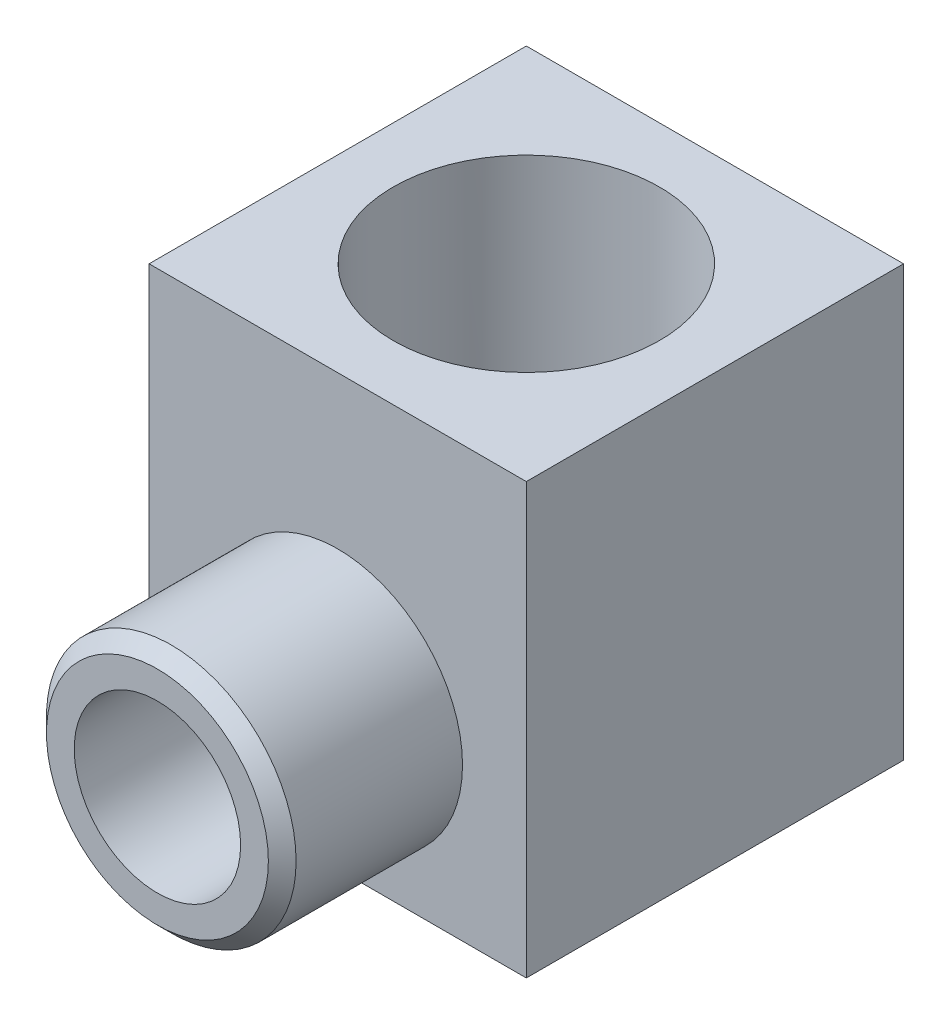
ISO-10303-21;
HEADER;
FILE_DESCRIPTION(('STEP AP214'),'2;1');
FILE_NAME('part.step','',(''),(''),'','','');
FILE_SCHEMA(('AUTOMOTIVE_DESIGN { 1 0 10303 214 1 1 1 1 }'));
ENDSEC;
DATA;
#1=APPLICATION_CONTEXT('core data for automotive mechanical design processes');
#2=APPLICATION_PROTOCOL_DEFINITION('international standard','automotive_design',2000,#1);
#3=PRODUCT_CONTEXT('',#1,'mechanical');
#4=PRODUCT('Part','Part','',(#3));
#5=PRODUCT_RELATED_PRODUCT_CATEGORY('part','',(#4));
#6=PRODUCT_DEFINITION_FORMATION('','',#4);
#7=PRODUCT_DEFINITION_CONTEXT('part definition',#1,'design');
#8=PRODUCT_DEFINITION('design','',#6,#7);
#9=PRODUCT_DEFINITION_SHAPE('','',#8);
#10=(LENGTH_UNIT() NAMED_UNIT(*) SI_UNIT(.MILLI.,.METRE.));
#11=(NAMED_UNIT(*) PLANE_ANGLE_UNIT() SI_UNIT($,.RADIAN.));
#12=(NAMED_UNIT(*) SI_UNIT($,.STERADIAN.) SOLID_ANGLE_UNIT());
#13=UNCERTAINTY_MEASURE_WITH_UNIT(LENGTH_MEASURE(1.E-05),#10,'distance_accuracy_value','');
#14=(GEOMETRIC_REPRESENTATION_CONTEXT(3) GLOBAL_UNCERTAINTY_ASSIGNED_CONTEXT((#13)) GLOBAL_UNIT_ASSIGNED_CONTEXT((#10,
#11,#12)) REPRESENTATION_CONTEXT('',''));
#15=CARTESIAN_POINT('',(0.,0.,0.));
#16=DIRECTION('',(0.,0.,1.));
#17=DIRECTION('',(1.,0.,0.));
#18=AXIS2_PLACEMENT_3D('',#15,#16,#17);
#19=CARTESIAN_POINT('',(0.,0.,13.6));
#20=DIRECTION('',(0.,0.,1.));
#21=DIRECTION('',(1.,0.,0.));
#22=AXIS2_PLACEMENT_3D('',#19,#20,#21);
#23=PLANE('',#22);
#24=CARTESIAN_POINT('',(0.,0.,13.6));
#25=DIRECTION('',(0.,0.,1.));
#26=DIRECTION('',(1.,0.,0.));
#27=AXIS2_PLACEMENT_3D('',#24,#25,#26);
#28=CIRCLE('',#27,4.5);
#29=CARTESIAN_POINT('',(4.5,0.,13.6));
#30=VERTEX_POINT('',#29);
#31=EDGE_CURVE('E119',#30,#30,#28,.T.);
#32=ORIENTED_EDGE('',*,*,#31,.F.);
#33=EDGE_LOOP('',(#32));
#34=FACE_BOUND('',#33,.T.);
#35=DIRECTION('',(0.,-1.,0.));
#36=VECTOR('',#35,1.);
#37=CARTESIAN_POINT('',(-6.8,-5.5,13.6));
#38=LINE('',#37,#36);
#39=CARTESIAN_POINT('',(-6.8,10.,13.6));
#40=VERTEX_POINT('',#39);
#41=CARTESIAN_POINT('',(-6.8,-5.5,13.6));
#42=VERTEX_POINT('',#41);
#43=EDGE_CURVE('E104',#40,#42,#38,.T.);
#44=ORIENTED_EDGE('',*,*,#43,.T.);
#45=DIRECTION('',(1.,0.,0.));
#46=VECTOR('',#45,1.);
#47=CARTESIAN_POINT('',(-6.8,-5.5,13.6));
#48=LINE('',#47,#46);
#49=CARTESIAN_POINT('',(6.8,-5.5,13.6));
#50=VERTEX_POINT('',#49);
#51=EDGE_CURVE('E67',#42,#50,#48,.T.);
#52=ORIENTED_EDGE('',*,*,#51,.T.);
#53=DIRECTION('',(0.,1.,0.));
#54=VECTOR('',#53,1.);
#55=CARTESIAN_POINT('',(6.8,-5.5,13.6));
#56=LINE('',#55,#54);
#57=CARTESIAN_POINT('',(6.8,10.,13.6));
#58=VERTEX_POINT('',#57);
#59=EDGE_CURVE('E95',#50,#58,#56,.T.);
#60=ORIENTED_EDGE('',*,*,#59,.T.);
#61=DIRECTION('',(-1.,0.,0.));
#62=VECTOR('',#61,1.);
#63=CARTESIAN_POINT('',(-6.8,10.,13.6));
#64=LINE('',#63,#62);
#65=EDGE_CURVE('E101',#58,#40,#64,.T.);
#66=ORIENTED_EDGE('',*,*,#65,.T.);
#67=EDGE_LOOP('',(#44,#52,#60,#66));
#68=FACE_BOUND('',#67,.T.);
#69=ADVANCED_FACE('F43',(#34,#68),#23,.T.);
#70=CARTESIAN_POINT('',(0.,0.,13.6));
#71=DIRECTION('',(0.,0.,1.));
#72=DIRECTION('',(1.,0.,0.));
#73=AXIS2_PLACEMENT_3D('',#70,#71,#72);
#74=CYLINDRICAL_SURFACE('',#73,4.5);
#75=CARTESIAN_POINT('',(0.,0.,19.6));
#76=DIRECTION('',(0.,0.,1.));
#77=DIRECTION('',(1.,0.,0.));
#78=AXIS2_PLACEMENT_3D('',#75,#76,#77);
#79=CIRCLE('',#78,4.5);
#80=CARTESIAN_POINT('',(4.5,0.,19.6));
#81=VERTEX_POINT('',#80);
#82=EDGE_CURVE('E13',#81,#81,#79,.F.);
#83=CARTESIAN_POINT('',(4.5,0.,19.6));
#84=CARTESIAN_POINT('',(4.5,0.,19.5375));
#85=CARTESIAN_POINT('',(4.5,0.,19.475));
#86=CARTESIAN_POINT('',(4.5,0.,19.35));
#87=CARTESIAN_POINT('',(4.5,0.,19.2875));
#88=CARTESIAN_POINT('',(4.5,0.,19.1625));
#89=CARTESIAN_POINT('',(4.5,0.,19.1));
#90=CARTESIAN_POINT('',(4.5,0.,18.975));
#91=CARTESIAN_POINT('',(4.5,0.,18.9125));
#92=CARTESIAN_POINT('',(4.5,0.,18.7875));
#93=CARTESIAN_POINT('',(4.5,0.,18.725));
#94=CARTESIAN_POINT('',(4.5,0.,18.6));
#95=CARTESIAN_POINT('',(4.5,0.,18.5375));
#96=CARTESIAN_POINT('',(4.5,0.,18.4125));
#97=CARTESIAN_POINT('',(4.5,0.,18.35));
#98=CARTESIAN_POINT('',(4.5,0.,18.225));
#99=CARTESIAN_POINT('',(4.5,0.,18.1625));
#100=CARTESIAN_POINT('',(4.5,0.,18.0375));
#101=CARTESIAN_POINT('',(4.5,0.,17.975));
#102=CARTESIAN_POINT('',(4.5,0.,17.85));
#103=CARTESIAN_POINT('',(4.5,0.,17.7875));
#104=CARTESIAN_POINT('',(4.5,0.,17.6625));
#105=CARTESIAN_POINT('',(4.5,0.,17.6));
#106=CARTESIAN_POINT('',(4.5,0.,17.475));
#107=CARTESIAN_POINT('',(4.5,0.,17.4125));
#108=CARTESIAN_POINT('',(4.5,0.,17.2875));
#109=CARTESIAN_POINT('',(4.5,0.,17.225));
#110=CARTESIAN_POINT('',(4.5,0.,17.1));
#111=CARTESIAN_POINT('',(4.5,0.,17.0375));
#112=CARTESIAN_POINT('',(4.5,0.,16.9125));
#113=CARTESIAN_POINT('',(4.5,0.,16.85));
#114=CARTESIAN_POINT('',(4.5,0.,16.725));
#115=CARTESIAN_POINT('',(4.5,0.,16.6625));
#116=CARTESIAN_POINT('',(4.5,0.,16.5375));
#117=CARTESIAN_POINT('',(4.5,0.,16.475));
#118=CARTESIAN_POINT('',(4.5,0.,16.35));
#119=CARTESIAN_POINT('',(4.5,0.,16.2875));
#120=CARTESIAN_POINT('',(4.5,0.,16.1625));
#121=CARTESIAN_POINT('',(4.5,0.,16.1));
#122=CARTESIAN_POINT('',(4.5,0.,15.975));
#123=CARTESIAN_POINT('',(4.5,0.,15.9125));
#124=CARTESIAN_POINT('',(4.5,0.,15.7875));
#125=CARTESIAN_POINT('',(4.5,0.,15.725));
#126=CARTESIAN_POINT('',(4.5,0.,15.6));
#127=CARTESIAN_POINT('',(4.5,0.,15.5375));
#128=CARTESIAN_POINT('',(4.5,0.,15.4125));
#129=CARTESIAN_POINT('',(4.5,0.,15.35));
#130=CARTESIAN_POINT('',(4.5,0.,15.225));
#131=CARTESIAN_POINT('',(4.5,0.,15.1625));
#132=CARTESIAN_POINT('',(4.5,0.,15.0375));
#133=CARTESIAN_POINT('',(4.5,0.,14.975));
#134=CARTESIAN_POINT('',(4.5,0.,14.85));
#135=CARTESIAN_POINT('',(4.5,0.,14.7875));
#136=CARTESIAN_POINT('',(4.5,0.,14.6625));
#137=CARTESIAN_POINT('',(4.5,0.,14.6));
#138=CARTESIAN_POINT('',(4.5,0.,14.475));
#139=CARTESIAN_POINT('',(4.5,0.,14.4125));
#140=CARTESIAN_POINT('',(4.5,0.,14.2875));
#141=CARTESIAN_POINT('',(4.5,0.,14.225));
#142=CARTESIAN_POINT('',(4.5,0.,14.1));
#143=CARTESIAN_POINT('',(4.5,0.,14.0375));
#144=CARTESIAN_POINT('',(4.5,0.,13.9125));
#145=CARTESIAN_POINT('',(4.5,0.,13.85));
#146=CARTESIAN_POINT('',(4.5,0.,13.725));
#147=CARTESIAN_POINT('',(4.5,0.,13.6625));
#148=CARTESIAN_POINT('',(4.5,0.,13.6));
#149=B_SPLINE_CURVE_WITH_KNOTS('',3,(#83,#84,#85,#86,#87,#88,#89,#90,#91,#92,#93,#94,#95,#96,
#97,#98,#99,#100,#101,#102,#103,#104,#105,#106,#107,#108,#109,#110,#111,#112,#113,#114,#115,
#116,#117,#118,#119,#120,#121,#122,#123,#124,#125,#126,#127,#128,#129,#130,#131,#132,#133,#134,
#135,#136,#137,#138,#139,#140,#141,#142,#143,#144,#145,#146,#147,#148),.UNSPECIFIED.,.F.,.F.,(4,
2,2,2,2,2,2,2,2,2,2,2,2,2,2,2,2,2,2,2,2,2,2,2,2,2,2,2,2,2,2,2,4),(0.,0.1875,0.375000000000004,
0.562500000000004,0.750000000000004,0.937500000000004,1.125,1.3125,1.5,1.6875,1.87500000000001,
2.06250000000001,2.25000000000001,2.43750000000001,2.62500000000001,2.81250000000001,
3.00000000000001,3.18750000000001,3.37500000000001,3.56250000000001,3.75000000000001,
3.93750000000001,4.12500000000001,4.31250000000001,4.50000000000001,4.68750000000001,
4.87500000000001,5.06250000000001,5.25000000000001,5.43750000000001,5.62500000000001,
5.81250000000001,6.00000000000001),.UNSPECIFIED.);
#150=EDGE_CURVE('BSEAM136',#81,#30,#149,.T.);
#151=ORIENTED_EDGE('',*,*,#82,.T.);
#152=ORIENTED_EDGE('',*,*,#31,.T.);
#153=ORIENTED_EDGE('',*,*,#150,.T.);
#154=ORIENTED_EDGE('',*,*,#150,.F.);
#155=EDGE_LOOP('',(#151,#153,#152,#154));
#156=FACE_BOUND('',#155,.T.);
#157=ADVANCED_FACE('F136',(#156),#74,.T.);
#158=CARTESIAN_POINT('',(0.,0.,20.1));
#159=DIRECTION('',(0.,0.,1.));
#160=DIRECTION('',(1.,0.,0.));
#161=AXIS2_PLACEMENT_3D('',#158,#159,#160);
#162=PLANE('',#161);
#163=CARTESIAN_POINT('',(0.,0.,20.1));
#164=DIRECTION('',(0.,0.,1.));
#165=DIRECTION('',(1.,0.,0.));
#166=AXIS2_PLACEMENT_3D('',#163,#164,#165);
#167=CIRCLE('',#166,3.);
#168=CARTESIAN_POINT('',(3.,0.,20.1));
#169=VERTEX_POINT('',#168);
#170=EDGE_CURVE('E116',#169,#169,#167,.T.);
#171=ORIENTED_EDGE('',*,*,#170,.F.);
#172=EDGE_LOOP('',(#171));
#173=FACE_BOUND('',#172,.T.);
#174=CARTESIAN_POINT('',(0.,0.,20.1));
#175=DIRECTION('',(0.,0.,1.));
#176=DIRECTION('',(1.,0.,0.));
#177=AXIS2_PLACEMENT_3D('',#174,#175,#176);
#178=CIRCLE('',#177,4.00000000000002);
#179=CARTESIAN_POINT('',(4.00000000000002,0.,20.1));
#180=VERTEX_POINT('',#179);
#181=EDGE_CURVE('E52',#180,#180,#178,.T.);
#182=ORIENTED_EDGE('',*,*,#181,.T.);
#183=EDGE_LOOP('',(#182));
#184=FACE_BOUND('',#183,.T.);
#185=ADVANCED_FACE('F125',(#173,#184),#162,.T.);
#186=CARTESIAN_POINT('',(0.,0.,20.1));
#187=DIRECTION('',(0.,0.,-1.));
#188=DIRECTION('',(-1.,0.,0.));
#189=AXIS2_PLACEMENT_3D('',#186,#187,#188);
#190=CONICAL_SURFACE('',#189,4.00000000000002,0.785398163397441);
#191=ORIENTED_EDGE('',*,*,#82,.F.);
#192=EDGE_LOOP('',(#191));
#193=FACE_BOUND('',#192,.T.);
#194=ORIENTED_EDGE('',*,*,#181,.F.);
#195=EDGE_LOOP('',(#194));
#196=FACE_BOUND('',#195,.T.);
#197=ADVANCED_FACE('F46',(#193,#196),#190,.T.);
#198=CARTESIAN_POINT('',(0.,0.,10.1));
#199=DIRECTION('',(0.,0.,1.));
#200=DIRECTION('',(1.,0.,0.));
#201=AXIS2_PLACEMENT_3D('',#198,#199,#200);
#202=CYLINDRICAL_SURFACE('',#201,3.);
#203=CARTESIAN_POINT('',(3.,0.,10.546998799039));
#204=CARTESIAN_POINT('',(2.99999929316566,-0.0745881017346189,10.546999898665));
#205=CARTESIAN_POINT('',(2.99721098330608,-0.149191136004952,10.549237888807));
#206=CARTESIAN_POINT('',(2.98612019809028,-0.297740615457289,10.5580750774283));
#207=CARTESIAN_POINT('',(2.9778144749812,-0.371686647908522,10.5646768445764));
#208=CARTESIAN_POINT('',(2.94477114070038,-0.591871257292455,10.5906674427021));
#209=CARTESIAN_POINT('',(2.91190789135751,-0.736257997426775,10.6162404352537));
#210=CARTESIAN_POINT('',(2.82691460569437,-1.01471783745388,10.6795972491244));
#211=CARTESIAN_POINT('',(2.77495153631042,-1.14886849806612,10.7172749045985));
#212=CARTESIAN_POINT('',(2.65372699717079,-1.40641023040088,10.8003920106133));
#213=CARTESIAN_POINT('',(2.58446505555621,-1.52980100850371,10.8458316728664));
#214=CARTESIAN_POINT('',(2.41977218910693,-1.7804807775644,10.9467107014625));
#215=CARTESIAN_POINT('',(2.32207710800338,-1.90607199000542,11.0026737741389));
#216=CARTESIAN_POINT('',(2.10795031988918,-2.14051386194855,11.1140660424004));
#217=CARTESIAN_POINT('',(1.99150246679738,-2.24934993594435,11.1694947339013));
#218=CARTESIAN_POINT('',(1.72600788699425,-2.46026435780722,11.2815142972558));
#219=CARTESIAN_POINT('',(1.57472321111582,-2.55994342134052,11.3374386533781));
#220=CARTESIAN_POINT('',(1.33396074652115,-2.68865418568348,11.4116870220653));
#221=CARTESIAN_POINT('',(1.25137489168925,-2.72809816599973,11.4348353971046));
#222=CARTESIAN_POINT('',(1.08211052113866,-2.79954562243594,11.4772452437052));
#223=CARTESIAN_POINT('',(0.995434882072555,-2.8315542372461,11.4965093984854));
#224=CARTESIAN_POINT('',(0.827640357499887,-2.88478057830754,11.5288011093659));
#225=CARTESIAN_POINT('',(0.746846377534298,-2.90676237182174,11.5422624318136));
#226=CARTESIAN_POINT('',(0.583197091078556,-2.94396274357603,11.56515490291));
#227=CARTESIAN_POINT('',(0.500343004130003,-2.95918522705945,11.5745883785567));
#228=CARTESIAN_POINT('',(0.333318539828547,-2.98261655716146,11.5891456440168));
#229=CARTESIAN_POINT('',(0.24914900909258,-2.99082973981614,11.5942720981739));
#230=CARTESIAN_POINT('',(0.0802937359917337,-3.00011905606704,11.6000735008694));
#231=CARTESIAN_POINT('',(-0.00439194583256893,-3.00119601115591,11.6007489617875));
#232=CARTESIAN_POINT('',(-0.23525409786637,-2.99432955174349,11.5964537554331));
#233=CARTESIAN_POINT('',(-0.381218214584867,-2.97923219630627,11.5870044907645));
#234=CARTESIAN_POINT('',(-0.667963793545683,-2.92832373843973,11.5554908393159));
#235=CARTESIAN_POINT('',(-0.808744863218141,-2.89251107042813,11.5334254990639));
#236=CARTESIAN_POINT('',(-1.0821263901114,-2.80174972886362,11.4785140485211));
#237=CARTESIAN_POINT('',(-1.21470488589566,-2.74675209652792,11.4456403685046));
#238=CARTESIAN_POINT('',(-1.4688481448743,-2.61967531320565,11.3716555010842));
#239=CARTESIAN_POINT('',(-1.59041039016418,-2.54759227067433,11.3305424373257));
#240=CARTESIAN_POINT('',(-1.835311796849,-2.37833229975016,11.2374372946823));
#241=CARTESIAN_POINT('',(-1.95698945502121,-2.27914886819721,11.1847280754551));
#242=CARTESIAN_POINT('',(-2.1830368025769,-2.06368231559825,11.0766911317327));
#243=CARTESIAN_POINT('',(-2.2873808620927,-1.94737434443897,11.021359682503));
#244=CARTESIAN_POINT('',(-2.48965064603807,-1.68310649607655,10.9057146019591));
#245=CARTESIAN_POINT('',(-2.58495875584479,-1.53299668379983,10.8456939524099));
#246=CARTESIAN_POINT('',(-2.74862769089555,-1.21524931540846,10.7363393381382));
#247=CARTESIAN_POINT('',(-2.81703815455924,-1.04764477562142,10.6869857643463));
#248=CARTESIAN_POINT('',(-2.9092456014676,-0.744553432256006,10.6182050378));
#249=CARTESIAN_POINT('',(-2.94004419848779,-0.612213688389327,10.5943209038978));
#250=CARTESIAN_POINT('',(-2.98344404773024,-0.342923548280771,10.5602993324478));
#251=CARTESIAN_POINT('',(-2.9960701607893,-0.205979713803309,10.5501431156064));
#252=CARTESIAN_POINT('',(-3.00236485457848,0.0689488376058324,10.5451072068206));
#253=CARTESIAN_POINT('',(-2.99598999132347,0.20693521924979,10.5502625231937));
#254=CARTESIAN_POINT('',(-2.9646176358833,0.479473378491058,10.5751050208752));
#255=CARTESIAN_POINT('',(-2.93960472155185,0.614022216261175,10.5948042364801));
#256=CARTESIAN_POINT('',(-2.87291834540731,0.874124179944719,10.6455214831968));
#257=CARTESIAN_POINT('',(-2.83152632032177,0.999789033265991,10.6763475769699));
#258=CARTESIAN_POINT('',(-2.73365926139293,1.24268938558944,10.7459736560647));
#259=CARTESIAN_POINT('',(-2.67717887421443,1.35992187402312,10.7847764703902));
#260=CARTESIAN_POINT('',(-2.53836720017101,1.60633545923451,10.8748933687563));
#261=CARTESIAN_POINT('',(-2.45316148843195,1.7335420193793,10.9271829389867));
#262=CARTESIAN_POINT('',(-2.26486412265136,1.97324020138555,11.0334530687461));
#263=CARTESIAN_POINT('',(-2.1617539118516,2.08571634191255,11.0874353345946));
#264=CARTESIAN_POINT('',(-1.92088094045174,2.31117689222138,11.2012043172883));
#265=CARTESIAN_POINT('',(-1.78021293053271,2.42135314053419,11.260534535643));
#266=CARTESIAN_POINT('',(-1.55436650534371,2.56749122991443,11.3420699926765));
#267=CARTESIAN_POINT('',(-1.47656966285657,2.61303335570715,11.3680157539303));
#268=CARTESIAN_POINT('',(-1.31641811917015,2.69726035235891,11.4167117473753));
#269=CARTESIAN_POINT('',(-1.23406631148695,2.73594951234181,11.4394639764651));
#270=CARTESIAN_POINT('',(-1.07033545025543,2.80388454782464,11.4798578036107));
#271=CARTESIAN_POINT('',(-0.989186787161121,2.83355352146009,11.4977220373192));
#272=CARTESIAN_POINT('',(-0.823964002411379,2.88592934138068,11.5294983493486));
#273=CARTESIAN_POINT('',(-0.73989160566671,2.90864021766085,11.5434127150122));
#274=CARTESIAN_POINT('',(-0.569568403790919,2.94672608268705,11.56686144186));
#275=CARTESIAN_POINT('',(-0.483319568335496,2.96210747043806,11.5763996233974));
#276=CARTESIAN_POINT('',(-0.309457807201864,2.98528725569192,11.5908102115971));
#277=CARTESIAN_POINT('',(-0.221845109617277,2.9930869076186,11.5956833900979));
#278=CARTESIAN_POINT('',(0.015732128986733,3.00368567812967,11.6022981498607));
#279=CARTESIAN_POINT('',(0.166246840469984,2.99911891389451,11.5994324445691));
#280=CARTESIAN_POINT('',(0.463899819096645,2.96769893014043,11.5798637291373));
#281=CARTESIAN_POINT('',(0.611038239138945,2.94084672189619,11.5631613468813));
#282=CARTESIAN_POINT('',(0.892896712692992,2.86761309177773,11.5183049932528));
#283=CARTESIAN_POINT('',(1.02787049942438,2.82194150915025,11.4905684106792));
#284=CARTESIAN_POINT('',(1.28811642039744,2.7130566476404,11.4258796569649));
#285=CARTESIAN_POINT('',(1.41338691327628,2.64984040924037,11.3889259311383));
#286=CARTESIAN_POINT('',(1.66477557190228,2.5004144647402,11.3042080866156));
#287=CARTESIAN_POINT('',(1.78963214589427,2.4124992108767,11.255720022211));
#288=CARTESIAN_POINT('',(2.02372001952908,2.21981612119762,11.1544074079875));
#289=CARTESIAN_POINT('',(2.13293342221275,2.11502926945988,11.1015779983414));
#290=CARTESIAN_POINT('',(2.34893659863772,1.87412098185594,10.9880099385829));
#291=CARTESIAN_POINT('',(2.45310793497384,1.73566006489574,10.927228861111));
#292=CARTESIAN_POINT('',(2.63705578214576,1.44085270830682,10.8121957694996));
#293=CARTESIAN_POINT('',(2.71684578498669,1.28451622662135,10.7579401544537));
#294=CARTESIAN_POINT('',(2.83437875294913,0.992633639054684,10.6743144773585));
#295=CARTESIAN_POINT('',(2.87750950292067,0.860075313414846,10.6420956720645));
#296=CARTESIAN_POINT('',(2.94510742103823,0.588072788398753,10.5905402972548));
#297=CARTESIAN_POINT('',(2.9696336689222,0.448651896240468,10.5711629738052));
#298=CARTESIAN_POINT('',(2.98943816567419,0.256728006424666,10.5554342916873));
#299=CARTESIAN_POINT('',(2.9933932060555,0.205529369149598,10.5522799316812));
#300=CARTESIAN_POINT('',(2.9986746975097,0.102889561257915,10.5480615432784));
#301=CARTESIAN_POINT('',(3.00000048755026,0.0514483329079787,10.5469980405545));
#302=CARTESIAN_POINT('',(3.,0.,10.546998799039));
#303=B_SPLINE_CURVE_WITH_KNOTS('',3,(#203,#204,#205,#206,#207,#208,#209,#210,#211,#212,#213,
#214,#215,#216,#217,#218,#219,#220,#221,#222,#223,#224,#225,#226,#227,#228,#229,#230,#231,#232,
#233,#234,#235,#236,#237,#238,#239,#240,#241,#242,#243,#244,#245,#246,#247,#248,#249,#250,#251,
#252,#253,#254,#255,#256,#257,#258,#259,#260,#261,#262,#263,#264,#265,#266,#267,#268,#269,#270,
#271,#272,#273,#274,#275,#276,#277,#278,#279,#280,#281,#282,#283,#284,#285,#286,#287,#288,#289,
#290,#291,#292,#293,#294,#295,#296,#297,#298,#299,#300,#301,#302),.UNSPECIFIED.,.T.,.F.,(4,2,2,
2,2,2,2,2,2,2,2,2,2,2,2,2,2,2,2,2,2,2,2,2,2,2,2,2,2,2,2,2,2,2,2,2,2,2,2,2,2,2,2,2,2,2,2,2,2,4),
(0.,0.223698379030153,0.447528551993395,0.895774656917625,1.34019202107759,1.78462150887126,
2.28867358422085,2.79316199031455,3.35851235119164,3.64135057040777,3.92399273051411,
4.17804174891848,4.43194379695804,4.68568866411136,4.9394043207104,5.37821651649737,
5.81706188032703,6.25703544231605,6.69710931356922,7.19194896244635,7.68751390285538,
8.24779447657587,8.80703616879964,9.2191874580394,9.63077436668791,10.0433030522907,
10.4561734663549,10.8622379427593,11.2684466822042,11.7519928531561,12.2360432101591,
12.7976792143743,13.0787653432056,13.3596749198207,13.6239750151271,13.888121742296,
14.1520374318989,14.4159094483226,14.8652148947105,15.3144999535135,15.7481981168537,
16.1819694830167,16.6607639167175,17.1401018251204,17.6885320762176,18.2366582881569,
18.6642541125975,19.0904863292288,19.2447470758086,19.3990466009026),.UNSPECIFIED.);
#304=CARTESIAN_POINT('',(3.,0.,10.546998799039));
#305=VERTEX_POINT('',#304);
#306=EDGE_CURVE('E106',#305,#305,#303,.T.);
#307=ORIENTED_EDGE('',*,*,#306,.T.);
#308=EDGE_LOOP('',(#307));
#309=FACE_BOUND('',#308,.T.);
#310=ORIENTED_EDGE('',*,*,#170,.T.);
#311=EDGE_LOOP('',(#310));
#312=FACE_BOUND('',#311,.T.);
#313=ADVANCED_FACE('F128',(#309,#312),#202,.F.);
#314=CARTESIAN_POINT('',(-6.8,-5.5,-36.5659058687187));
#315=DIRECTION('',(0.,-1.,0.));
#316=DIRECTION('',(0.,0.,-1.));
#317=AXIS2_PLACEMENT_3D('',#314,#315,#316);
#318=PLANE('',#317);
#319=DIRECTION('',(0.,0.,1.));
#320=VECTOR('',#319,1.);
#321=CARTESIAN_POINT('',(6.8,-5.5,-36.5659058687187));
#322=LINE('',#321,#320);
#323=CARTESIAN_POINT('',(6.8,-5.5,0.));
#324=VERTEX_POINT('',#323);
#325=EDGE_CURVE('E84',#324,#50,#322,.T.);
#326=ORIENTED_EDGE('',*,*,#325,.T.);
#327=ORIENTED_EDGE('',*,*,#51,.F.);
#328=DIRECTION('',(0.,0.,1.));
#329=VECTOR('',#328,1.);
#330=CARTESIAN_POINT('',(-6.8,-5.5,-36.5659058687187));
#331=LINE('',#330,#329);
#332=CARTESIAN_POINT('',(-6.8,-5.5,0.));
#333=VERTEX_POINT('',#332);
#334=EDGE_CURVE('E92',#333,#42,#331,.T.);
#335=ORIENTED_EDGE('',*,*,#334,.F.);
#336=DIRECTION('',(-1.,0.,0.));
#337=VECTOR('',#336,1.);
#338=CARTESIAN_POINT('',(-6.8,-5.5,0.));
#339=LINE('',#338,#337);
#340=EDGE_CURVE('E88',#324,#333,#339,.T.);
#341=ORIENTED_EDGE('',*,*,#340,.F.);
#342=EDGE_LOOP('',(#326,#327,#335,#341));
#343=FACE_BOUND('',#342,.T.);
#344=ADVANCED_FACE('F86',(#343),#318,.T.);
#345=CARTESIAN_POINT('',(6.8,-5.5,-36.5659058687187));
#346=DIRECTION('',(1.,0.,0.));
#347=DIRECTION('',(0.,0.,-1.));
#348=AXIS2_PLACEMENT_3D('',#345,#346,#347);
#349=PLANE('',#348);
#350=DIRECTION('',(0.,0.,1.));
#351=VECTOR('',#350,1.);
#352=CARTESIAN_POINT('',(6.8,10.,-36.5659058687187));
#353=LINE('',#352,#351);
#354=CARTESIAN_POINT('',(6.8,10.,0.));
#355=VERTEX_POINT('',#354);
#356=EDGE_CURVE('E91',#355,#58,#353,.T.);
#357=ORIENTED_EDGE('',*,*,#356,.T.);
#358=ORIENTED_EDGE('',*,*,#59,.F.);
#359=ORIENTED_EDGE('',*,*,#325,.F.);
#360=DIRECTION('',(0.,-1.,0.));
#361=VECTOR('',#360,1.);
#362=CARTESIAN_POINT('',(6.8,-5.5,0.));
#363=LINE('',#362,#361);
#364=EDGE_CURVE('E120',#355,#324,#363,.T.);
#365=ORIENTED_EDGE('',*,*,#364,.F.);
#366=EDGE_LOOP('',(#357,#358,#359,#365));
#367=FACE_BOUND('',#366,.T.);
#368=ADVANCED_FACE('F96',(#367),#349,.T.);
#369=CARTESIAN_POINT('',(-6.8,10.,-36.5659058687187));
#370=DIRECTION('',(0.,1.,0.));
#371=DIRECTION('',(0.,0.,1.));
#372=AXIS2_PLACEMENT_3D('',#369,#370,#371);
#373=PLANE('',#372);
#374=CARTESIAN_POINT('',(0.,10.,6.8));
#375=DIRECTION('',(0.,1.,0.));
#376=DIRECTION('',(0.,0.,1.));
#377=AXIS2_PLACEMENT_3D('',#374,#375,#376);
#378=CIRCLE('',#377,4.8);
#379=CARTESIAN_POINT('',(0.,10.,11.6));
#380=VERTEX_POINT('',#379);
#381=EDGE_CURVE('E257',#380,#380,#378,.T.);
#382=ORIENTED_EDGE('',*,*,#381,.F.);
#383=EDGE_LOOP('',(#382));
#384=FACE_BOUND('',#383,.T.);
#385=DIRECTION('',(0.,0.,1.));
#386=VECTOR('',#385,1.);
#387=CARTESIAN_POINT('',(-6.8,10.,-36.5659058687187));
#388=LINE('',#387,#386);
#389=CARTESIAN_POINT('',(-6.8,10.,0.));
#390=VERTEX_POINT('',#389);
#391=EDGE_CURVE('E59',#390,#40,#388,.T.);
#392=ORIENTED_EDGE('',*,*,#391,.T.);
#393=ORIENTED_EDGE('',*,*,#65,.F.);
#394=ORIENTED_EDGE('',*,*,#356,.F.);
#395=DIRECTION('',(1.,0.,0.));
#396=VECTOR('',#395,1.);
#397=CARTESIAN_POINT('',(-6.8,10.,0.));
#398=LINE('',#397,#396);
#399=EDGE_CURVE('E165',#390,#355,#398,.T.);
#400=ORIENTED_EDGE('',*,*,#399,.F.);
#401=EDGE_LOOP('',(#392,#393,#394,#400));
#402=FACE_BOUND('',#401,.T.);
#403=ADVANCED_FACE('F161',(#384,#402),#373,.T.);
#404=CARTESIAN_POINT('',(-6.8,-5.5,-36.5659058687187));
#405=DIRECTION('',(-1.,0.,0.));
#406=DIRECTION('',(0.,0.,1.));
#407=AXIS2_PLACEMENT_3D('',#404,#405,#406);
#408=PLANE('',#407);
#409=ORIENTED_EDGE('',*,*,#334,.T.);
#410=ORIENTED_EDGE('',*,*,#43,.F.);
#411=ORIENTED_EDGE('',*,*,#391,.F.);
#412=DIRECTION('',(0.,1.,0.));
#413=VECTOR('',#412,1.);
#414=CARTESIAN_POINT('',(-6.8,-5.5,0.));
#415=LINE('',#414,#413);
#416=EDGE_CURVE('E115',#333,#390,#415,.T.);
#417=ORIENTED_EDGE('',*,*,#416,.F.);
#418=EDGE_LOOP('',(#409,#410,#411,#417));
#419=FACE_BOUND('',#418,.T.);
#420=ADVANCED_FACE('F152',(#419),#408,.T.);
#421=CARTESIAN_POINT('',(0.,0.,0.));
#422=DIRECTION('',(0.,0.,1.));
#423=DIRECTION('',(1.,0.,0.));
#424=AXIS2_PLACEMENT_3D('',#421,#422,#423);
#425=PLANE('',#424);
#426=ORIENTED_EDGE('',*,*,#340,.T.);
#427=ORIENTED_EDGE('',*,*,#416,.T.);
#428=ORIENTED_EDGE('',*,*,#399,.T.);
#429=ORIENTED_EDGE('',*,*,#364,.T.);
#430=EDGE_LOOP('',(#426,#427,#428,#429));
#431=FACE_BOUND('',#430,.T.);
#432=ADVANCED_FACE('F149',(#431),#425,.F.);
#433=CARTESIAN_POINT('',(0.,-19.0764501987817,6.8));
#434=DIRECTION('',(0.,1.,0.));
#435=DIRECTION('',(0.,0.,1.));
#436=AXIS2_PLACEMENT_3D('',#433,#434,#435);
#437=CYLINDRICAL_SURFACE('',#436,4.8);
#438=CARTESIAN_POINT('',(0.,-3.5,6.8));
#439=DIRECTION('',(0.,-1.,0.));
#440=DIRECTION('',(0.,0.,-1.));
#441=AXIS2_PLACEMENT_3D('',#438,#439,#440);
#442=CIRCLE('',#441,4.8);
#443=CARTESIAN_POINT('',(0.,-3.5,2.));
#444=VERTEX_POINT('',#443);
#445=EDGE_CURVE('E174',#444,#444,#442,.F.);
#446=ORIENTED_EDGE('',*,*,#445,.F.);
#447=EDGE_LOOP('',(#446));
#448=FACE_BOUND('',#447,.T.);
#449=ORIENTED_EDGE('',*,*,#381,.T.);
#450=EDGE_LOOP('',(#449));
#451=FACE_BOUND('',#450,.T.);
#452=ORIENTED_EDGE('',*,*,#306,.F.);
#453=EDGE_LOOP('',(#452));
#454=FACE_BOUND('',#453,.T.);
#455=ADVANCED_FACE('F151',(#448,#451,#454),#437,.F.);
#456=CARTESIAN_POINT('',(-6.8,-3.5,-36.5659058687187));
#457=DIRECTION('',(0.,-1.,0.));
#458=DIRECTION('',(0.,0.,-1.));
#459=AXIS2_PLACEMENT_3D('',#456,#457,#458);
#460=PLANE('',#459);
#461=ORIENTED_EDGE('',*,*,#445,.T.);
#462=EDGE_LOOP('',(#461));
#463=FACE_BOUND('',#462,.T.);
#464=ADVANCED_FACE('F158',(#463),#460,.F.);
#465=CLOSED_SHELL('',(#69,#157,#185,#197,#313,#344,#368,#403,#420,#432,#455,#464));
#466=MANIFOLD_SOLID_BREP('B2',#465);
#467=ADVANCED_BREP_SHAPE_REPRESENTATION('',(#18,#466),#14);
#468=SHAPE_DEFINITION_REPRESENTATION(#9,#467);
ENDSEC;
END-ISO-10303-21;
